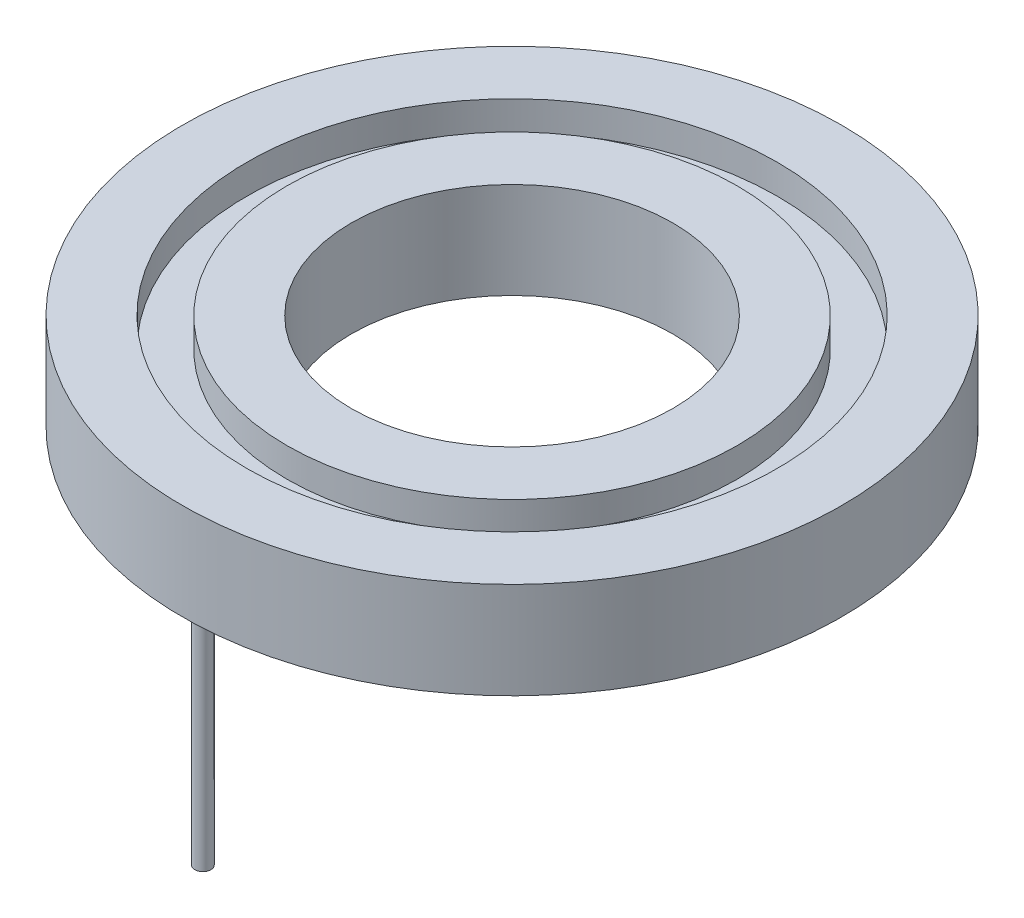
ISO-10303-21;
HEADER;
FILE_DESCRIPTION(('STEP AP214'),'2;1');
FILE_NAME('part.step','',(''),(''),'','','');
FILE_SCHEMA(('AUTOMOTIVE_DESIGN { 1 0 10303 214 1 1 1 1 }'));
ENDSEC;
DATA;
#1=APPLICATION_CONTEXT('core data for automotive mechanical design processes');
#2=APPLICATION_PROTOCOL_DEFINITION('international standard','automotive_design',2000,#1);
#3=PRODUCT_CONTEXT('',#1,'mechanical');
#4=PRODUCT('Part','Part','',(#3));
#5=PRODUCT_RELATED_PRODUCT_CATEGORY('part','',(#4));
#6=PRODUCT_DEFINITION_FORMATION('','',#4);
#7=PRODUCT_DEFINITION_CONTEXT('part definition',#1,'design');
#8=PRODUCT_DEFINITION('design','',#6,#7);
#9=PRODUCT_DEFINITION_SHAPE('','',#8);
#10=(LENGTH_UNIT() NAMED_UNIT(*) SI_UNIT(.MILLI.,.METRE.));
#11=(NAMED_UNIT(*) PLANE_ANGLE_UNIT() SI_UNIT($,.RADIAN.));
#12=(NAMED_UNIT(*) SI_UNIT($,.STERADIAN.) SOLID_ANGLE_UNIT());
#13=UNCERTAINTY_MEASURE_WITH_UNIT(LENGTH_MEASURE(1.E-05),#10,'distance_accuracy_value','');
#14=(GEOMETRIC_REPRESENTATION_CONTEXT(3) GLOBAL_UNCERTAINTY_ASSIGNED_CONTEXT((#13)) GLOBAL_UNIT_ASSIGNED_CONTEXT((#10,
#11,#12)) REPRESENTATION_CONTEXT('',''));
#15=CARTESIAN_POINT('',(0.,0.,0.));
#16=DIRECTION('',(0.,0.,1.));
#17=DIRECTION('',(1.,0.,0.));
#18=AXIS2_PLACEMENT_3D('',#15,#16,#17);
#19=CARTESIAN_POINT('',(0.,11.9615190403259,0.));
#20=DIRECTION('',(0.,1.,0.));
#21=DIRECTION('',(0.,0.,1.));
#22=AXIS2_PLACEMENT_3D('',#19,#20,#21);
#23=PLANE('',#22);
#24=CARTESIAN_POINT('',(0.,11.9615190403259,0.));
#25=DIRECTION('',(0.,-1.,0.));
#26=DIRECTION('',(0.,0.,-1.));
#27=AXIS2_PLACEMENT_3D('',#24,#25,#26);
#28=CIRCLE('',#27,20.);
#29=CARTESIAN_POINT('',(0.,11.9615190403259,-20.));
#30=VERTEX_POINT('',#29);
#31=EDGE_CURVE('E10',#30,#30,#28,.T.);
#32=ORIENTED_EDGE('',*,*,#31,.T.);
#33=EDGE_LOOP('',(#32));
#34=FACE_BOUND('',#33,.T.);
#35=CARTESIAN_POINT('',(0.,11.9615190403259,0.));
#36=DIRECTION('',(0.,-1.,0.));
#37=DIRECTION('',(0.,0.,-1.));
#38=AXIS2_PLACEMENT_3D('',#35,#36,#37);
#39=CIRCLE('',#38,28.);
#40=CARTESIAN_POINT('',(0.,11.9615190403259,-28.));
#41=VERTEX_POINT('',#40);
#42=EDGE_CURVE('E75',#41,#41,#39,.T.);
#43=ORIENTED_EDGE('',*,*,#42,.F.);
#44=EDGE_LOOP('',(#43));
#45=FACE_BOUND('',#44,.T.);
#46=ADVANCED_FACE('F35',(#34,#45),#23,.T.);
#47=CARTESIAN_POINT('',(0.,0.,0.));
#48=DIRECTION('',(0.,-1.,0.));
#49=DIRECTION('',(0.,0.,-1.));
#50=AXIS2_PLACEMENT_3D('',#47,#48,#49);
#51=CYLINDRICAL_SURFACE('',#50,20.);
#52=CARTESIAN_POINT('',(0.,0.,0.));
#53=DIRECTION('',(0.,-1.,0.));
#54=DIRECTION('',(0.,0.,-1.));
#55=AXIS2_PLACEMENT_3D('',#52,#53,#54);
#56=CIRCLE('',#55,20.);
#57=CARTESIAN_POINT('',(0.,0.,-20.));
#58=VERTEX_POINT('',#57);
#59=EDGE_CURVE('E41',#58,#58,#56,.T.);
#60=ORIENTED_EDGE('',*,*,#59,.T.);
#61=EDGE_LOOP('',(#60));
#62=FACE_BOUND('',#61,.T.);
#63=ORIENTED_EDGE('',*,*,#31,.F.);
#64=EDGE_LOOP('',(#63));
#65=FACE_BOUND('',#64,.T.);
#66=ADVANCED_FACE('F124',(#62,#65),#51,.F.);
#67=CARTESIAN_POINT('',(0.,0.,0.));
#68=DIRECTION('',(0.,-1.,0.));
#69=DIRECTION('',(0.,0.,-1.));
#70=AXIS2_PLACEMENT_3D('',#67,#68,#69);
#71=PLANE('',#70);
#72=CARTESIAN_POINT('',(0.,0.,0.));
#73=DIRECTION('',(0.,-1.,0.));
#74=DIRECTION('',(0.,0.,-1.));
#75=AXIS2_PLACEMENT_3D('',#72,#73,#74);
#76=CIRCLE('',#75,28.);
#77=CARTESIAN_POINT('',(0.,0.,-28.));
#78=VERTEX_POINT('',#77);
#79=EDGE_CURVE('E45',#78,#78,#76,.T.);
#80=ORIENTED_EDGE('',*,*,#79,.T.);
#81=EDGE_LOOP('',(#80));
#82=FACE_BOUND('',#81,.T.);
#83=ORIENTED_EDGE('',*,*,#59,.F.);
#84=EDGE_LOOP('',(#83));
#85=FACE_BOUND('',#84,.T.);
#86=ADVANCED_FACE('F118',(#82,#85),#71,.T.);
#87=CARTESIAN_POINT('',(0.,0.,0.));
#88=DIRECTION('',(0.,-1.,0.));
#89=DIRECTION('',(0.,0.,-1.));
#90=AXIS2_PLACEMENT_3D('',#87,#88,#89);
#91=CYLINDRICAL_SURFACE('',#90,28.);
#92=CARTESIAN_POINT('',(0.,3.662344450803,0.));
#93=DIRECTION('',(0.,-1.,0.));
#94=DIRECTION('',(0.,0.,-1.));
#95=AXIS2_PLACEMENT_3D('',#92,#93,#94);
#96=CIRCLE('',#95,28.);
#97=CARTESIAN_POINT('',(0.,3.662344450803,-28.));
#98=VERTEX_POINT('',#97);
#99=EDGE_CURVE('E49',#98,#98,#96,.T.);
#100=ORIENTED_EDGE('',*,*,#99,.T.);
#101=EDGE_LOOP('',(#100));
#102=FACE_BOUND('',#101,.T.);
#103=ORIENTED_EDGE('',*,*,#79,.F.);
#104=EDGE_LOOP('',(#103));
#105=FACE_BOUND('',#104,.T.);
#106=ADVANCED_FACE('F112',(#102,#105),#91,.T.);
#107=CARTESIAN_POINT('',(0.,3.662344450803,0.));
#108=DIRECTION('',(0.,-1.,0.));
#109=DIRECTION('',(0.,0.,-1.));
#110=AXIS2_PLACEMENT_3D('',#107,#108,#109);
#111=PLANE('',#110);
#112=CARTESIAN_POINT('',(0.,3.662344450803,0.));
#113=DIRECTION('',(0.,-1.,0.));
#114=DIRECTION('',(0.,0.,-1.));
#115=AXIS2_PLACEMENT_3D('',#112,#113,#114);
#116=CIRCLE('',#115,33.);
#117=CARTESIAN_POINT('',(0.,3.662344450803,-33.));
#118=VERTEX_POINT('',#117);
#119=EDGE_CURVE('E54',#118,#118,#116,.T.);
#120=ORIENTED_EDGE('',*,*,#119,.T.);
#121=EDGE_LOOP('',(#120));
#122=FACE_BOUND('',#121,.T.);
#123=ORIENTED_EDGE('',*,*,#99,.F.);
#124=EDGE_LOOP('',(#123));
#125=FACE_BOUND('',#124,.T.);
#126=ADVANCED_FACE('F106',(#122,#125),#111,.T.);
#127=CARTESIAN_POINT('',(0.,0.,0.));
#128=DIRECTION('',(0.,-1.,0.));
#129=DIRECTION('',(0.,0.,-1.));
#130=AXIS2_PLACEMENT_3D('',#127,#128,#129);
#131=CYLINDRICAL_SURFACE('',#130,33.);
#132=CARTESIAN_POINT('',(0.,0.,0.));
#133=DIRECTION('',(0.,-1.,0.));
#134=DIRECTION('',(0.,0.,-1.));
#135=AXIS2_PLACEMENT_3D('',#132,#133,#134);
#136=CIRCLE('',#135,33.);
#137=CARTESIAN_POINT('',(0.,0.,-33.));
#138=VERTEX_POINT('',#137);
#139=EDGE_CURVE('E57',#138,#138,#136,.T.);
#140=ORIENTED_EDGE('',*,*,#139,.T.);
#141=EDGE_LOOP('',(#140));
#142=FACE_BOUND('',#141,.T.);
#143=ORIENTED_EDGE('',*,*,#119,.F.);
#144=EDGE_LOOP('',(#143));
#145=FACE_BOUND('',#144,.T.);
#146=ADVANCED_FACE('F98',(#142,#145),#131,.F.);
#147=CARTESIAN_POINT('',(0.,0.,0.));
#148=DIRECTION('',(0.,-1.,0.));
#149=DIRECTION('',(0.,0.,-1.));
#150=AXIS2_PLACEMENT_3D('',#147,#148,#149);
#151=PLANE('',#150);
#152=CARTESIAN_POINT('',(0.996647287020619,0.,39.4581721361344));
#153=DIRECTION('',(0.,-1.,0.));
#154=DIRECTION('',(0.,0.,-1.));
#155=AXIS2_PLACEMENT_3D('',#152,#153,#154);
#156=CIRCLE('',#155,1.);
#157=CARTESIAN_POINT('',(0.996647287020619,0.,38.4581721361344));
#158=VERTEX_POINT('',#157);
#159=EDGE_CURVE('E79',#158,#158,#156,.T.);
#160=ORIENTED_EDGE('',*,*,#159,.F.);
#161=EDGE_LOOP('',(#160));
#162=FACE_BOUND('',#161,.T.);
#163=CARTESIAN_POINT('',(0.,0.,0.));
#164=DIRECTION('',(0.,-1.,0.));
#165=DIRECTION('',(0.,0.,-1.));
#166=AXIS2_PLACEMENT_3D('',#163,#164,#165);
#167=CIRCLE('',#166,41.);
#168=CARTESIAN_POINT('',(0.,0.,-41.));
#169=VERTEX_POINT('',#168);
#170=EDGE_CURVE('E60',#169,#169,#167,.T.);
#171=ORIENTED_EDGE('',*,*,#170,.T.);
#172=EDGE_LOOP('',(#171));
#173=FACE_BOUND('',#172,.T.);
#174=ORIENTED_EDGE('',*,*,#139,.F.);
#175=EDGE_LOOP('',(#174));
#176=FACE_BOUND('',#175,.T.);
#177=ADVANCED_FACE('F94',(#162,#173,#176),#151,.T.);
#178=CARTESIAN_POINT('',(0.,0.,0.));
#179=DIRECTION('',(0.,-1.,0.));
#180=DIRECTION('',(0.,0.,-1.));
#181=AXIS2_PLACEMENT_3D('',#178,#179,#180);
#182=CYLINDRICAL_SURFACE('',#181,41.);
#183=CARTESIAN_POINT('',(0.,12.,0.));
#184=DIRECTION('',(0.,-1.,0.));
#185=DIRECTION('',(0.,0.,-1.));
#186=AXIS2_PLACEMENT_3D('',#183,#184,#185);
#187=CIRCLE('',#186,41.);
#188=CARTESIAN_POINT('',(0.,12.,-41.));
#189=VERTEX_POINT('',#188);
#190=EDGE_CURVE('E63',#189,#189,#187,.T.);
#191=ORIENTED_EDGE('',*,*,#190,.T.);
#192=EDGE_LOOP('',(#191));
#193=FACE_BOUND('',#192,.T.);
#194=ORIENTED_EDGE('',*,*,#170,.F.);
#195=EDGE_LOOP('',(#194));
#196=FACE_BOUND('',#195,.T.);
#197=ADVANCED_FACE('F97',(#193,#196),#182,.T.);
#198=CARTESIAN_POINT('',(0.,12.,0.));
#199=DIRECTION('',(0.,1.,0.));
#200=DIRECTION('',(0.,0.,1.));
#201=AXIS2_PLACEMENT_3D('',#198,#199,#200);
#202=PLANE('',#201);
#203=CARTESIAN_POINT('',(0.,12.,0.));
#204=DIRECTION('',(0.,-1.,0.));
#205=DIRECTION('',(0.,0.,-1.));
#206=AXIS2_PLACEMENT_3D('',#203,#204,#205);
#207=CIRCLE('',#206,33.);
#208=CARTESIAN_POINT('',(0.,12.,-33.));
#209=VERTEX_POINT('',#208);
#210=EDGE_CURVE('E66',#209,#209,#207,.T.);
#211=ORIENTED_EDGE('',*,*,#210,.T.);
#212=EDGE_LOOP('',(#211));
#213=FACE_BOUND('',#212,.T.);
#214=ORIENTED_EDGE('',*,*,#190,.F.);
#215=EDGE_LOOP('',(#214));
#216=FACE_BOUND('',#215,.T.);
#217=ADVANCED_FACE('F149',(#213,#216),#202,.T.);
#218=CARTESIAN_POINT('',(0.,0.,0.));
#219=DIRECTION('',(0.,-1.,0.));
#220=DIRECTION('',(0.,0.,-1.));
#221=AXIS2_PLACEMENT_3D('',#218,#219,#220);
#222=CYLINDRICAL_SURFACE('',#221,33.);
#223=CARTESIAN_POINT('',(0.,8.33765554919701,0.));
#224=DIRECTION('',(0.,-1.,0.));
#225=DIRECTION('',(0.,0.,-1.));
#226=AXIS2_PLACEMENT_3D('',#223,#224,#225);
#227=CIRCLE('',#226,33.);
#228=CARTESIAN_POINT('',(0.,8.33765554919701,-33.));
#229=VERTEX_POINT('',#228);
#230=EDGE_CURVE('E69',#229,#229,#227,.T.);
#231=ORIENTED_EDGE('',*,*,#230,.T.);
#232=EDGE_LOOP('',(#231));
#233=FACE_BOUND('',#232,.T.);
#234=ORIENTED_EDGE('',*,*,#210,.F.);
#235=EDGE_LOOP('',(#234));
#236=FACE_BOUND('',#235,.T.);
#237=ADVANCED_FACE('F143',(#233,#236),#222,.F.);
#238=CARTESIAN_POINT('',(0.,8.33765554919701,0.));
#239=DIRECTION('',(0.,1.,0.));
#240=DIRECTION('',(0.,0.,1.));
#241=AXIS2_PLACEMENT_3D('',#238,#239,#240);
#242=PLANE('',#241);
#243=CARTESIAN_POINT('',(0.,8.33765554919701,0.));
#244=DIRECTION('',(0.,-1.,0.));
#245=DIRECTION('',(0.,0.,-1.));
#246=AXIS2_PLACEMENT_3D('',#243,#244,#245);
#247=CIRCLE('',#246,28.);
#248=CARTESIAN_POINT('',(0.,8.33765554919701,-28.));
#249=VERTEX_POINT('',#248);
#250=EDGE_CURVE('E72',#249,#249,#247,.T.);
#251=ORIENTED_EDGE('',*,*,#250,.T.);
#252=EDGE_LOOP('',(#251));
#253=FACE_BOUND('',#252,.T.);
#254=ORIENTED_EDGE('',*,*,#230,.F.);
#255=EDGE_LOOP('',(#254));
#256=FACE_BOUND('',#255,.T.);
#257=ADVANCED_FACE('F137',(#253,#256),#242,.T.);
#258=CARTESIAN_POINT('',(0.,0.,0.));
#259=DIRECTION('',(0.,-1.,0.));
#260=DIRECTION('',(0.,0.,-1.));
#261=AXIS2_PLACEMENT_3D('',#258,#259,#260);
#262=CYLINDRICAL_SURFACE('',#261,28.);
#263=ORIENTED_EDGE('',*,*,#42,.T.);
#264=EDGE_LOOP('',(#263));
#265=FACE_BOUND('',#264,.T.);
#266=ORIENTED_EDGE('',*,*,#250,.F.);
#267=EDGE_LOOP('',(#266));
#268=FACE_BOUND('',#267,.T.);
#269=ADVANCED_FACE('F90',(#265,#268),#262,.T.);
#270=CARTESIAN_POINT('',(0.996647287020619,-27.,39.4581721361344));
#271=DIRECTION('',(0.,1.,0.));
#272=DIRECTION('',(0.,0.,1.));
#273=AXIS2_PLACEMENT_3D('',#270,#271,#272);
#274=CYLINDRICAL_SURFACE('',#273,1.);
#275=CARTESIAN_POINT('',(0.996647287020619,-27.,39.4581721361344));
#276=DIRECTION('',(0.,-1.,0.));
#277=DIRECTION('',(0.,0.,-1.));
#278=AXIS2_PLACEMENT_3D('',#275,#276,#277);
#279=CIRCLE('',#278,1.);
#280=CARTESIAN_POINT('',(0.996647287020619,-27.,38.4581721361344));
#281=VERTEX_POINT('',#280);
#282=EDGE_CURVE('E78',#281,#281,#279,.T.);
#283=ORIENTED_EDGE('',*,*,#282,.F.);
#284=EDGE_LOOP('',(#283));
#285=FACE_BOUND('',#284,.T.);
#286=ORIENTED_EDGE('',*,*,#159,.T.);
#287=EDGE_LOOP('',(#286));
#288=FACE_BOUND('',#287,.T.);
#289=ADVANCED_FACE('F87',(#285,#288),#274,.T.);
#290=CARTESIAN_POINT('',(0.996647287020619,-27.,39.4581721361344));
#291=DIRECTION('',(0.,-1.,0.));
#292=DIRECTION('',(0.,0.,-1.));
#293=AXIS2_PLACEMENT_3D('',#290,#291,#292);
#294=PLANE('',#293);
#295=ORIENTED_EDGE('',*,*,#282,.T.);
#296=EDGE_LOOP('',(#295));
#297=FACE_BOUND('',#296,.T.);
#298=ADVANCED_FACE('F85',(#297),#294,.T.);
#299=CLOSED_SHELL('',(#46,#66,#86,#106,#126,#146,#177,#197,#217,#237,#257,#269,#289,#298));
#300=MANIFOLD_SOLID_BREP('B2',#299);
#301=ADVANCED_BREP_SHAPE_REPRESENTATION('',(#18,#300),#14);
#302=SHAPE_DEFINITION_REPRESENTATION(#9,#301);
ENDSEC;
END-ISO-10303-21;
